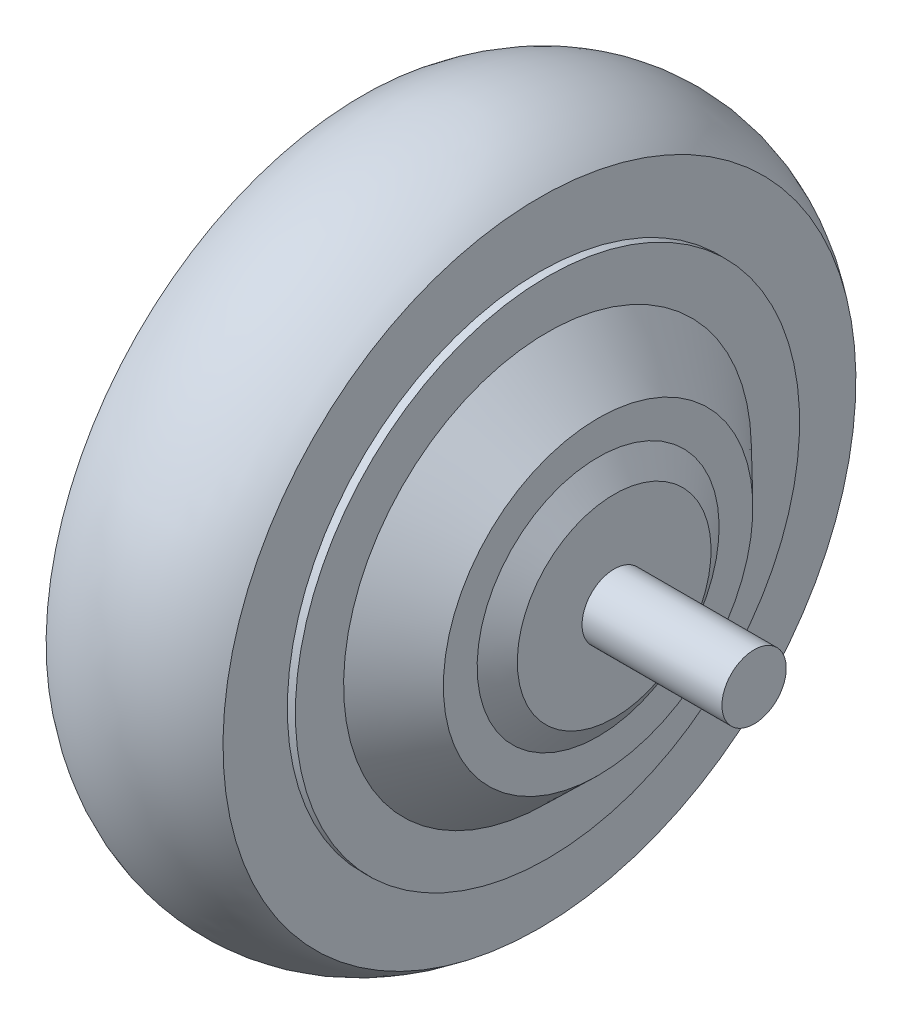
ISO-10303-21;
HEADER;
FILE_DESCRIPTION(('STEP AP214'),'2;1');
FILE_NAME('part.step','',(''),(''),'','','');
FILE_SCHEMA(('AUTOMOTIVE_DESIGN { 1 0 10303 214 1 1 1 1 }'));
ENDSEC;
DATA;
#1=APPLICATION_CONTEXT('core data for automotive mechanical design processes');
#2=APPLICATION_PROTOCOL_DEFINITION('international standard','automotive_design',2000,#1);
#3=PRODUCT_CONTEXT('',#1,'mechanical');
#4=PRODUCT('Part','Part','',(#3));
#5=PRODUCT_RELATED_PRODUCT_CATEGORY('part','',(#4));
#6=PRODUCT_DEFINITION_FORMATION('','',#4);
#7=PRODUCT_DEFINITION_CONTEXT('part definition',#1,'design');
#8=PRODUCT_DEFINITION('design','',#6,#7);
#9=PRODUCT_DEFINITION_SHAPE('','',#8);
#10=(LENGTH_UNIT() NAMED_UNIT(*) SI_UNIT(.MILLI.,.METRE.));
#11=(NAMED_UNIT(*) PLANE_ANGLE_UNIT() SI_UNIT($,.RADIAN.));
#12=(NAMED_UNIT(*) SI_UNIT($,.STERADIAN.) SOLID_ANGLE_UNIT());
#13=UNCERTAINTY_MEASURE_WITH_UNIT(LENGTH_MEASURE(1.E-05),#10,'distance_accuracy_value','');
#14=(GEOMETRIC_REPRESENTATION_CONTEXT(3) GLOBAL_UNCERTAINTY_ASSIGNED_CONTEXT((#13)) GLOBAL_UNIT_ASSIGNED_CONTEXT((#10,
#11,#12)) REPRESENTATION_CONTEXT('',''));
#15=CARTESIAN_POINT('',(0.,0.,0.));
#16=DIRECTION('',(0.,0.,1.));
#17=DIRECTION('',(1.,0.,0.));
#18=AXIS2_PLACEMENT_3D('',#15,#16,#17);
#19=CARTESIAN_POINT('',(-34.6,86.5,0.));
#20=DIRECTION('',(-1.,0.,0.));
#21=DIRECTION('',(0.,-1.,0.));
#22=AXIS2_PLACEMENT_3D('',#19,#20,#21);
#23=CYLINDRICAL_SURFACE('',#22,62.7213151776324);
#24=CARTESIAN_POINT('',(-24.,86.5,0.));
#25=DIRECTION('',(-1.,0.,0.));
#26=DIRECTION('',(0.,-1.,0.));
#27=AXIS2_PLACEMENT_3D('',#24,#25,#26);
#28=CIRCLE('',#27,62.7213151776324);
#29=CARTESIAN_POINT('',(-24.,23.7786848223676,0.));
#30=VERTEX_POINT('',#29);
#31=EDGE_CURVE('E10',#30,#30,#28,.T.);
#32=ORIENTED_EDGE('',*,*,#31,.F.);
#33=EDGE_LOOP('',(#32));
#34=FACE_BOUND('',#33,.T.);
#35=CARTESIAN_POINT('',(-22.,86.5,0.));
#36=DIRECTION('',(-1.,0.,0.));
#37=DIRECTION('',(0.,-1.,0.));
#38=AXIS2_PLACEMENT_3D('',#35,#36,#37);
#39=CIRCLE('',#38,62.7213151776324);
#40=CARTESIAN_POINT('',(-21.9999999999999,23.7786848223676,0.));
#41=VERTEX_POINT('',#40);
#42=EDGE_CURVE('E78',#41,#41,#39,.T.);
#43=ORIENTED_EDGE('',*,*,#42,.T.);
#44=EDGE_LOOP('',(#43));
#45=FACE_BOUND('',#44,.T.);
#46=ADVANCED_FACE('F32',(#34,#45),#23,.T.);
#47=CARTESIAN_POINT('',(-24.,149.221315177632,0.));
#48=DIRECTION('',(1.,0.,0.));
#49=DIRECTION('',(0.,1.,0.));
#50=AXIS2_PLACEMENT_3D('',#47,#48,#49);
#51=PLANE('',#50);
#52=CARTESIAN_POINT('',(-24.,86.5,0.));
#53=DIRECTION('',(-1.,0.,0.));
#54=DIRECTION('',(0.,-1.,0.));
#55=AXIS2_PLACEMENT_3D('',#52,#53,#54);
#56=CIRCLE('',#55,50.7213151776324);
#57=CARTESIAN_POINT('',(-24.,35.7786848223676,0.));
#58=VERTEX_POINT('',#57);
#59=EDGE_CURVE('E38',#58,#58,#56,.T.);
#60=ORIENTED_EDGE('',*,*,#59,.F.);
#61=EDGE_LOOP('',(#60));
#62=FACE_BOUND('',#61,.T.);
#63=ORIENTED_EDGE('',*,*,#31,.T.);
#64=EDGE_LOOP('',(#63));
#65=FACE_BOUND('',#64,.T.);
#66=ADVANCED_FACE('F154',(#62,#65),#51,.F.);
#67=CARTESIAN_POINT('',(-24.,86.5,0.));
#68=DIRECTION('',(1.,0.,0.));
#69=DIRECTION('',(0.,1.,0.));
#70=AXIS2_PLACEMENT_3D('',#67,#68,#69);
#71=CONICAL_SURFACE('',#70,50.7213151776324,0.856322896527876);
#72=CARTESIAN_POINT('',(-34.6,86.5,0.));
#73=DIRECTION('',(-1.,0.,0.));
#74=DIRECTION('',(0.,-1.,0.));
#75=AXIS2_PLACEMENT_3D('',#72,#73,#74);
#76=CIRCLE('',#75,38.5);
#77=CARTESIAN_POINT('',(-34.6,48.,0.));
#78=VERTEX_POINT('',#77);
#79=EDGE_CURVE('E42',#78,#78,#76,.T.);
#80=ORIENTED_EDGE('',*,*,#79,.F.);
#81=EDGE_LOOP('',(#80));
#82=FACE_BOUND('',#81,.T.);
#83=ORIENTED_EDGE('',*,*,#59,.T.);
#84=EDGE_LOOP('',(#83));
#85=FACE_BOUND('',#84,.T.);
#86=ADVANCED_FACE('F150',(#82,#85),#71,.T.);
#87=CARTESIAN_POINT('',(-34.6,125.,0.));
#88=DIRECTION('',(1.,0.,0.));
#89=DIRECTION('',(0.,1.,0.));
#90=AXIS2_PLACEMENT_3D('',#87,#88,#89);
#91=PLANE('',#90);
#92=ORIENTED_EDGE('',*,*,#79,.T.);
#93=EDGE_LOOP('',(#92));
#94=FACE_BOUND('',#93,.T.);
#95=ADVANCED_FACE('F145',(#94),#91,.F.);
#96=CARTESIAN_POINT('',(75.4,94.5,0.));
#97=DIRECTION('',(-1.,0.,0.));
#98=DIRECTION('',(0.,-1.,0.));
#99=AXIS2_PLACEMENT_3D('',#96,#97,#98);
#100=PLANE('',#99);
#101=CARTESIAN_POINT('',(75.4,86.5,0.));
#102=DIRECTION('',(-1.,0.,0.));
#103=DIRECTION('',(0.,-1.,0.));
#104=AXIS2_PLACEMENT_3D('',#101,#102,#103);
#105=CIRCLE('',#104,7.99999999999999);
#106=CARTESIAN_POINT('',(75.4,78.5,0.));
#107=VERTEX_POINT('',#106);
#108=EDGE_CURVE('E46',#107,#107,#105,.T.);
#109=ORIENTED_EDGE('',*,*,#108,.F.);
#110=EDGE_LOOP('',(#109));
#111=FACE_BOUND('',#110,.T.);
#112=ADVANCED_FACE('F140',(#111),#100,.F.);
#113=CARTESIAN_POINT('',(-34.6,86.5,0.));
#114=DIRECTION('',(-1.,0.,0.));
#115=DIRECTION('',(0.,-1.,0.));
#116=AXIS2_PLACEMENT_3D('',#113,#114,#115);
#117=CYLINDRICAL_SURFACE('',#116,7.99999999999999);
#118=CARTESIAN_POINT('',(40.6,86.5,0.));
#119=DIRECTION('',(-1.,0.,0.));
#120=DIRECTION('',(0.,-1.,0.));
#121=AXIS2_PLACEMENT_3D('',#118,#119,#120);
#122=CIRCLE('',#121,7.99999999999998);
#123=CARTESIAN_POINT('',(40.6,78.5,0.));
#124=VERTEX_POINT('',#123);
#125=EDGE_CURVE('E51',#124,#124,#122,.T.);
#126=ORIENTED_EDGE('',*,*,#125,.F.);
#127=EDGE_LOOP('',(#126));
#128=FACE_BOUND('',#127,.T.);
#129=ORIENTED_EDGE('',*,*,#108,.T.);
#130=EDGE_LOOP('',(#129));
#131=FACE_BOUND('',#130,.T.);
#132=ADVANCED_FACE('F134',(#128,#131),#117,.T.);
#133=CARTESIAN_POINT('',(40.6,110.6,0.));
#134=DIRECTION('',(-1.,0.,0.));
#135=DIRECTION('',(0.,-1.,0.));
#136=AXIS2_PLACEMENT_3D('',#133,#134,#135);
#137=PLANE('',#136);
#138=CARTESIAN_POINT('',(40.6,86.5,0.));
#139=DIRECTION('',(-1.,0.,0.));
#140=DIRECTION('',(0.,-1.,0.));
#141=AXIS2_PLACEMENT_3D('',#138,#139,#140);
#142=CIRCLE('',#141,24.1);
#143=CARTESIAN_POINT('',(40.6,62.4000000000001,0.));
#144=VERTEX_POINT('',#143);
#145=EDGE_CURVE('E54',#144,#144,#142,.T.);
#146=ORIENTED_EDGE('',*,*,#145,.F.);
#147=EDGE_LOOP('',(#146));
#148=FACE_BOUND('',#147,.T.);
#149=ORIENTED_EDGE('',*,*,#125,.T.);
#150=EDGE_LOOP('',(#149));
#151=FACE_BOUND('',#150,.T.);
#152=ADVANCED_FACE('F128',(#148,#151),#137,.F.);
#153=CARTESIAN_POINT('',(40.6,86.5,0.));
#154=DIRECTION('',(-1.,0.,0.));
#155=DIRECTION('',(0.,-1.,0.));
#156=AXIS2_PLACEMENT_3D('',#153,#154,#155);
#157=CONICAL_SURFACE('',#156,24.1,0.982793723247329);
#158=CARTESIAN_POINT('',(36.6,86.5,0.));
#159=DIRECTION('',(-1.,0.,0.));
#160=DIRECTION('',(0.,-1.,0.));
#161=AXIS2_PLACEMENT_3D('',#158,#159,#160);
#162=CIRCLE('',#161,30.1);
#163=CARTESIAN_POINT('',(36.6,56.4,0.));
#164=VERTEX_POINT('',#163);
#165=EDGE_CURVE('E57',#164,#164,#162,.T.);
#166=ORIENTED_EDGE('',*,*,#165,.F.);
#167=EDGE_LOOP('',(#166));
#168=FACE_BOUND('',#167,.T.);
#169=ORIENTED_EDGE('',*,*,#145,.T.);
#170=EDGE_LOOP('',(#169));
#171=FACE_BOUND('',#170,.T.);
#172=ADVANCED_FACE('F122',(#168,#171),#157,.T.);
#173=CARTESIAN_POINT('',(36.6,125.,0.));
#174=DIRECTION('',(-1.,0.,0.));
#175=DIRECTION('',(0.,-1.,0.));
#176=AXIS2_PLACEMENT_3D('',#173,#174,#175);
#177=PLANE('',#176);
#178=CARTESIAN_POINT('',(36.6,86.5,0.));
#179=DIRECTION('',(-1.,0.,0.));
#180=DIRECTION('',(0.,-1.,0.));
#181=AXIS2_PLACEMENT_3D('',#178,#179,#180);
#182=CIRCLE('',#181,38.5);
#183=CARTESIAN_POINT('',(36.6,48.,0.));
#184=VERTEX_POINT('',#183);
#185=EDGE_CURVE('E60',#184,#184,#182,.T.);
#186=ORIENTED_EDGE('',*,*,#185,.F.);
#187=EDGE_LOOP('',(#186));
#188=FACE_BOUND('',#187,.T.);
#189=ORIENTED_EDGE('',*,*,#165,.T.);
#190=EDGE_LOOP('',(#189));
#191=FACE_BOUND('',#190,.T.);
#192=ADVANCED_FACE('F116',(#188,#191),#177,.F.);
#193=CARTESIAN_POINT('',(36.6,86.5,0.));
#194=DIRECTION('',(-1.,0.,0.));
#195=DIRECTION('',(0.,-1.,0.));
#196=AXIS2_PLACEMENT_3D('',#193,#194,#195);
#197=CONICAL_SURFACE('',#196,38.5,0.770142910280873);
#198=CARTESIAN_POINT('',(24.,86.5,0.));
#199=DIRECTION('',(-1.,0.,0.));
#200=DIRECTION('',(0.,-1.,0.));
#201=AXIS2_PLACEMENT_3D('',#198,#199,#200);
#202=CIRCLE('',#201,50.7213151776323);
#203=CARTESIAN_POINT('',(24.,35.7786848223677,0.));
#204=VERTEX_POINT('',#203);
#205=EDGE_CURVE('E63',#204,#204,#202,.T.);
#206=ORIENTED_EDGE('',*,*,#205,.F.);
#207=EDGE_LOOP('',(#206));
#208=FACE_BOUND('',#207,.T.);
#209=ORIENTED_EDGE('',*,*,#185,.T.);
#210=EDGE_LOOP('',(#209));
#211=FACE_BOUND('',#210,.T.);
#212=ADVANCED_FACE('F110',(#208,#211),#197,.T.);
#213=CARTESIAN_POINT('',(24.,149.221315177632,0.));
#214=DIRECTION('',(-1.,0.,0.));
#215=DIRECTION('',(0.,-1.,0.));
#216=AXIS2_PLACEMENT_3D('',#213,#214,#215);
#217=PLANE('',#216);
#218=CARTESIAN_POINT('',(24.,86.5,0.));
#219=DIRECTION('',(-1.,0.,0.));
#220=DIRECTION('',(0.,-1.,0.));
#221=AXIS2_PLACEMENT_3D('',#218,#219,#220);
#222=CIRCLE('',#221,62.7213151776324);
#223=CARTESIAN_POINT('',(24.,23.7786848223677,0.));
#224=VERTEX_POINT('',#223);
#225=EDGE_CURVE('E66',#224,#224,#222,.T.);
#226=ORIENTED_EDGE('',*,*,#225,.F.);
#227=EDGE_LOOP('',(#226));
#228=FACE_BOUND('',#227,.T.);
#229=ORIENTED_EDGE('',*,*,#205,.T.);
#230=EDGE_LOOP('',(#229));
#231=FACE_BOUND('',#230,.T.);
#232=ADVANCED_FACE('F104',(#228,#231),#217,.F.);
#233=CARTESIAN_POINT('',(-34.6,86.5,0.));
#234=DIRECTION('',(-1.,0.,0.));
#235=DIRECTION('',(0.,-1.,0.));
#236=AXIS2_PLACEMENT_3D('',#233,#234,#235);
#237=CYLINDRICAL_SURFACE('',#236,62.7213151776324);
#238=CARTESIAN_POINT('',(22.,86.5,0.));
#239=DIRECTION('',(-1.,0.,0.));
#240=DIRECTION('',(0.,-1.,0.));
#241=AXIS2_PLACEMENT_3D('',#238,#239,#240);
#242=CIRCLE('',#241,62.7213151776324);
#243=CARTESIAN_POINT('',(22.,23.7786848223677,0.));
#244=VERTEX_POINT('',#243);
#245=EDGE_CURVE('E69',#244,#244,#242,.T.);
#246=ORIENTED_EDGE('',*,*,#245,.F.);
#247=EDGE_LOOP('',(#246));
#248=FACE_BOUND('',#247,.T.);
#249=ORIENTED_EDGE('',*,*,#225,.T.);
#250=EDGE_LOOP('',(#249));
#251=FACE_BOUND('',#250,.T.);
#252=ADVANCED_FACE('F98',(#248,#251),#237,.T.);
#253=CARTESIAN_POINT('',(22.,165.221315177632,0.));
#254=DIRECTION('',(-1.,0.,0.));
#255=DIRECTION('',(0.,-1.,0.));
#256=AXIS2_PLACEMENT_3D('',#253,#254,#255);
#257=PLANE('',#256);
#258=CARTESIAN_POINT('',(22.,86.5,0.));
#259=DIRECTION('',(-1.,0.,0.));
#260=DIRECTION('',(0.,-1.,0.));
#261=AXIS2_PLACEMENT_3D('',#258,#259,#260);
#262=CIRCLE('',#261,78.7213151776324);
#263=CARTESIAN_POINT('',(22.0000000000001,7.77868482236765,0.));
#264=VERTEX_POINT('',#263);
#265=EDGE_CURVE('E72',#264,#264,#262,.T.);
#266=ORIENTED_EDGE('',*,*,#265,.F.);
#267=EDGE_LOOP('',(#266));
#268=FACE_BOUND('',#267,.T.);
#269=ORIENTED_EDGE('',*,*,#245,.T.);
#270=EDGE_LOOP('',(#269));
#271=FACE_BOUND('',#270,.T.);
#272=ADVANCED_FACE('F92',(#268,#271),#257,.F.);
#273=CARTESIAN_POINT('',(0.,86.5,0.));
#274=DIRECTION('',(-1.,0.,0.));
#275=DIRECTION('',(0.,-1.,0.));
#276=AXIS2_PLACEMENT_3D('',#273,#274,#275);
#277=TOROIDAL_SURFACE('',#276,51.5,35.);
#278=CARTESIAN_POINT('',(-22.,86.5,0.));
#279=DIRECTION('',(-1.,0.,0.));
#280=DIRECTION('',(0.,-1.,0.));
#281=AXIS2_PLACEMENT_3D('',#278,#279,#280);
#282=CIRCLE('',#281,78.7213151776324);
#283=CARTESIAN_POINT('',(-21.9999999999999,7.7786848223676,0.));
#284=VERTEX_POINT('',#283);
#285=EDGE_CURVE('E75',#284,#284,#282,.T.);
#286=ORIENTED_EDGE('',*,*,#285,.F.);
#287=EDGE_LOOP('',(#286));
#288=FACE_BOUND('',#287,.T.);
#289=ORIENTED_EDGE('',*,*,#265,.T.);
#290=EDGE_LOOP('',(#289));
#291=FACE_BOUND('',#290,.T.);
#292=ADVANCED_FACE('F86',(#288,#291),#277,.T.);
#293=CARTESIAN_POINT('',(-22.,165.221315177632,0.));
#294=DIRECTION('',(1.,0.,0.));
#295=DIRECTION('',(0.,1.,0.));
#296=AXIS2_PLACEMENT_3D('',#293,#294,#295);
#297=PLANE('',#296);
#298=ORIENTED_EDGE('',*,*,#42,.F.);
#299=EDGE_LOOP('',(#298));
#300=FACE_BOUND('',#299,.T.);
#301=ORIENTED_EDGE('',*,*,#285,.T.);
#302=EDGE_LOOP('',(#301));
#303=FACE_BOUND('',#302,.T.);
#304=ADVANCED_FACE('F83',(#300,#303),#297,.F.);
#305=CLOSED_SHELL('',(#46,#66,#86,#95,#112,#132,#152,#172,#192,#212,#232,#252,#272,#292,#304));
#306=MANIFOLD_SOLID_BREP('B2',#305);
#307=ADVANCED_BREP_SHAPE_REPRESENTATION('',(#18,#306),#14);
#308=SHAPE_DEFINITION_REPRESENTATION(#9,#307);
ENDSEC;
END-ISO-10303-21;
